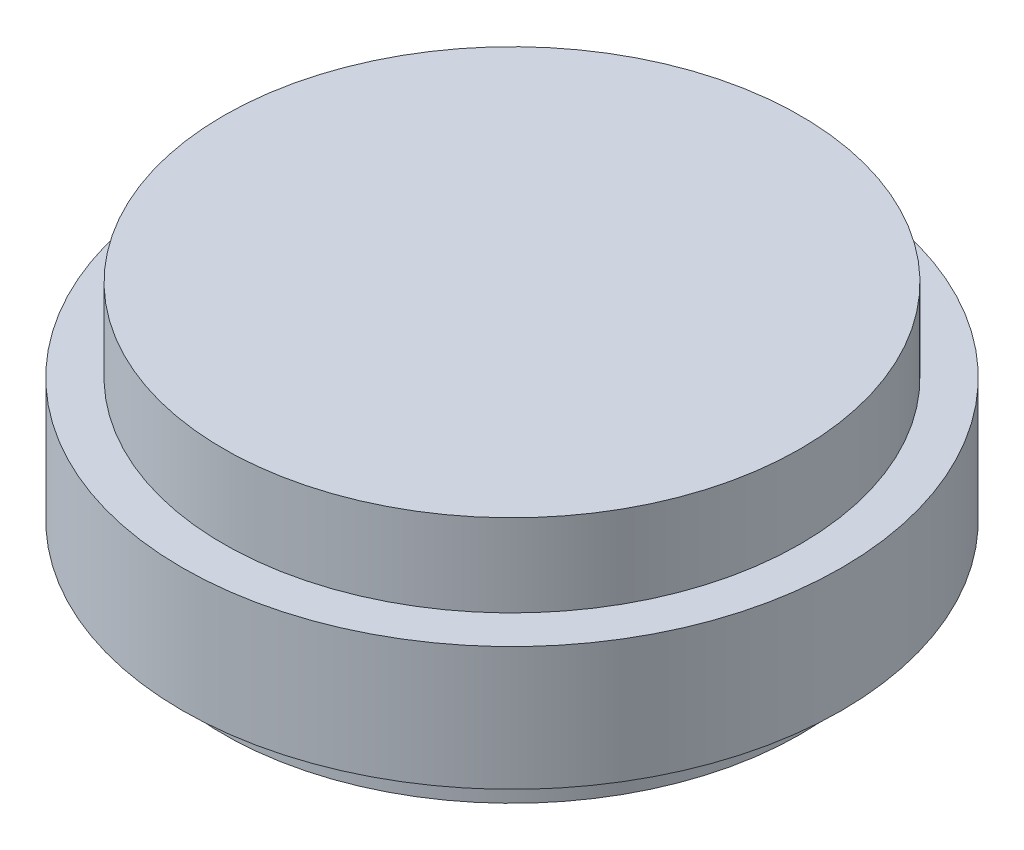
ISO-10303-21;
HEADER;
FILE_DESCRIPTION(('STEP AP214'),'2;1');
FILE_NAME('part.step','',(''),(''),'','','');
FILE_SCHEMA(('AUTOMOTIVE_DESIGN { 1 0 10303 214 1 1 1 1 }'));
ENDSEC;
DATA;
#1=APPLICATION_CONTEXT('core data for automotive mechanical design processes');
#2=APPLICATION_PROTOCOL_DEFINITION('international standard','automotive_design',2000,#1);
#3=PRODUCT_CONTEXT('',#1,'mechanical');
#4=PRODUCT('Part','Part','',(#3));
#5=PRODUCT_RELATED_PRODUCT_CATEGORY('part','',(#4));
#6=PRODUCT_DEFINITION_FORMATION('','',#4);
#7=PRODUCT_DEFINITION_CONTEXT('part definition',#1,'design');
#8=PRODUCT_DEFINITION('design','',#6,#7);
#9=PRODUCT_DEFINITION_SHAPE('','',#8);
#10=(LENGTH_UNIT() NAMED_UNIT(*) SI_UNIT(.MILLI.,.METRE.));
#11=(NAMED_UNIT(*) PLANE_ANGLE_UNIT() SI_UNIT($,.RADIAN.));
#12=(NAMED_UNIT(*) SI_UNIT($,.STERADIAN.) SOLID_ANGLE_UNIT());
#13=UNCERTAINTY_MEASURE_WITH_UNIT(LENGTH_MEASURE(1.E-05),#10,'distance_accuracy_value','');
#14=(GEOMETRIC_REPRESENTATION_CONTEXT(3) GLOBAL_UNCERTAINTY_ASSIGNED_CONTEXT((#13)) GLOBAL_UNIT_ASSIGNED_CONTEXT((#10,
#11,#12)) REPRESENTATION_CONTEXT('',''));
#15=CARTESIAN_POINT('',(0.,0.,0.));
#16=DIRECTION('',(0.,0.,1.));
#17=DIRECTION('',(1.,0.,0.));
#18=AXIS2_PLACEMENT_3D('',#15,#16,#17);
#19=CARTESIAN_POINT('',(0.,0.,0.));
#20=DIRECTION('',(0.,1.,0.));
#21=DIRECTION('',(-1.,0.,0.));
#22=AXIS2_PLACEMENT_3D('',#19,#20,#21);
#23=PLANE('',#22);
#24=CARTESIAN_POINT('',(0.,0.,0.));
#25=DIRECTION('',(0.,1.,0.));
#26=DIRECTION('',(-1.,0.,0.));
#27=AXIS2_PLACEMENT_3D('',#24,#25,#26);
#28=CIRCLE('',#27,3.5);
#29=CARTESIAN_POINT('',(-3.5,0.,0.));
#30=VERTEX_POINT('',#29);
#31=EDGE_CURVE('E10',#30,#30,#28,.T.);
#32=ORIENTED_EDGE('',*,*,#31,.F.);
#33=EDGE_LOOP('',(#32));
#34=FACE_BOUND('',#33,.T.);
#35=ADVANCED_FACE('F39',(#34),#23,.F.);
#36=CARTESIAN_POINT('',(0.,3.,0.));
#37=DIRECTION('',(0.,1.,0.));
#38=DIRECTION('',(-1.,0.,0.));
#39=AXIS2_PLACEMENT_3D('',#36,#37,#38);
#40=CYLINDRICAL_SURFACE('',#39,3.5);
#41=CARTESIAN_POINT('',(0.,0.5,0.));
#42=DIRECTION('',(0.,1.,0.));
#43=DIRECTION('',(-1.,0.,0.));
#44=AXIS2_PLACEMENT_3D('',#41,#42,#43);
#45=CIRCLE('',#44,3.5);
#46=CARTESIAN_POINT('',(-3.5,0.5,0.));
#47=VERTEX_POINT('',#46);
#48=EDGE_CURVE('E45',#47,#47,#45,.T.);
#49=ORIENTED_EDGE('',*,*,#48,.F.);
#50=EDGE_LOOP('',(#49));
#51=FACE_BOUND('',#50,.T.);
#52=ORIENTED_EDGE('',*,*,#31,.T.);
#53=EDGE_LOOP('',(#52));
#54=FACE_BOUND('',#53,.T.);
#55=ADVANCED_FACE('F87',(#51,#54),#40,.T.);
#56=CARTESIAN_POINT('',(3.5,0.5,0.));
#57=DIRECTION('',(0.,1.,0.));
#58=DIRECTION('',(-1.,0.,0.));
#59=AXIS2_PLACEMENT_3D('',#56,#57,#58);
#60=PLANE('',#59);
#61=CARTESIAN_POINT('',(0.,0.5,0.));
#62=DIRECTION('',(0.,1.,0.));
#63=DIRECTION('',(-1.,0.,0.));
#64=AXIS2_PLACEMENT_3D('',#61,#62,#63);
#65=CIRCLE('',#64,4.);
#66=CARTESIAN_POINT('',(-4.,0.5,0.));
#67=VERTEX_POINT('',#66);
#68=EDGE_CURVE('E49',#67,#67,#65,.T.);
#69=ORIENTED_EDGE('',*,*,#68,.F.);
#70=EDGE_LOOP('',(#69));
#71=FACE_BOUND('',#70,.T.);
#72=ORIENTED_EDGE('',*,*,#48,.T.);
#73=EDGE_LOOP('',(#72));
#74=FACE_BOUND('',#73,.T.);
#75=ADVANCED_FACE('F82',(#71,#74),#60,.F.);
#76=CARTESIAN_POINT('',(0.,3.,0.));
#77=DIRECTION('',(0.,1.,0.));
#78=DIRECTION('',(-1.,0.,0.));
#79=AXIS2_PLACEMENT_3D('',#76,#77,#78);
#80=CYLINDRICAL_SURFACE('',#79,4.);
#81=CARTESIAN_POINT('',(0.,2.,0.));
#82=DIRECTION('',(0.,1.,0.));
#83=DIRECTION('',(-1.,0.,0.));
#84=AXIS2_PLACEMENT_3D('',#81,#82,#83);
#85=CIRCLE('',#84,4.);
#86=CARTESIAN_POINT('',(-4.,2.,0.));
#87=VERTEX_POINT('',#86);
#88=EDGE_CURVE('E53',#87,#87,#85,.T.);
#89=ORIENTED_EDGE('',*,*,#88,.F.);
#90=EDGE_LOOP('',(#89));
#91=FACE_BOUND('',#90,.T.);
#92=ORIENTED_EDGE('',*,*,#68,.T.);
#93=EDGE_LOOP('',(#92));
#94=FACE_BOUND('',#93,.T.);
#95=ADVANCED_FACE('F76',(#91,#94),#80,.T.);
#96=CARTESIAN_POINT('',(4.,2.,0.));
#97=DIRECTION('',(0.,-1.,0.));
#98=DIRECTION('',(1.,0.,0.));
#99=AXIS2_PLACEMENT_3D('',#96,#97,#98);
#100=PLANE('',#99);
#101=CARTESIAN_POINT('',(0.,2.,0.));
#102=DIRECTION('',(0.,1.,0.));
#103=DIRECTION('',(-1.,0.,0.));
#104=AXIS2_PLACEMENT_3D('',#101,#102,#103);
#105=CIRCLE('',#104,3.5);
#106=CARTESIAN_POINT('',(-3.5,2.,0.));
#107=VERTEX_POINT('',#106);
#108=EDGE_CURVE('E58',#107,#107,#105,.T.);
#109=ORIENTED_EDGE('',*,*,#108,.F.);
#110=EDGE_LOOP('',(#109));
#111=FACE_BOUND('',#110,.T.);
#112=ORIENTED_EDGE('',*,*,#88,.T.);
#113=EDGE_LOOP('',(#112));
#114=FACE_BOUND('',#113,.T.);
#115=ADVANCED_FACE('F70',(#111,#114),#100,.F.);
#116=CARTESIAN_POINT('',(0.,3.,0.));
#117=DIRECTION('',(0.,1.,0.));
#118=DIRECTION('',(-1.,0.,0.));
#119=AXIS2_PLACEMENT_3D('',#116,#117,#118);
#120=CYLINDRICAL_SURFACE('',#119,3.5);
#121=CARTESIAN_POINT('',(0.,3.,0.));
#122=DIRECTION('',(0.,1.,0.));
#123=DIRECTION('',(-1.,0.,0.));
#124=AXIS2_PLACEMENT_3D('',#121,#122,#123);
#125=CIRCLE('',#124,3.5);
#126=CARTESIAN_POINT('',(-3.5,3.,0.));
#127=VERTEX_POINT('',#126);
#128=EDGE_CURVE('E61',#127,#127,#125,.T.);
#129=ORIENTED_EDGE('',*,*,#128,.F.);
#130=EDGE_LOOP('',(#129));
#131=FACE_BOUND('',#130,.T.);
#132=ORIENTED_EDGE('',*,*,#108,.T.);
#133=EDGE_LOOP('',(#132));
#134=FACE_BOUND('',#133,.T.);
#135=ADVANCED_FACE('F67',(#131,#134),#120,.T.);
#136=CARTESIAN_POINT('',(3.5,3.,0.));
#137=DIRECTION('',(0.,-1.,0.));
#138=DIRECTION('',(1.,0.,0.));
#139=AXIS2_PLACEMENT_3D('',#136,#137,#138);
#140=PLANE('',#139);
#141=ORIENTED_EDGE('',*,*,#128,.T.);
#142=EDGE_LOOP('',(#141));
#143=FACE_BOUND('',#142,.T.);
#144=ADVANCED_FACE('F65',(#143),#140,.F.);
#145=CLOSED_SHELL('',(#35,#55,#75,#95,#115,#135,#144));
#146=MANIFOLD_SOLID_BREP('B2',#145);
#147=ADVANCED_BREP_SHAPE_REPRESENTATION('',(#18,#146),#14);
#148=SHAPE_DEFINITION_REPRESENTATION(#9,#147);
ENDSEC;
END-ISO-10303-21;
